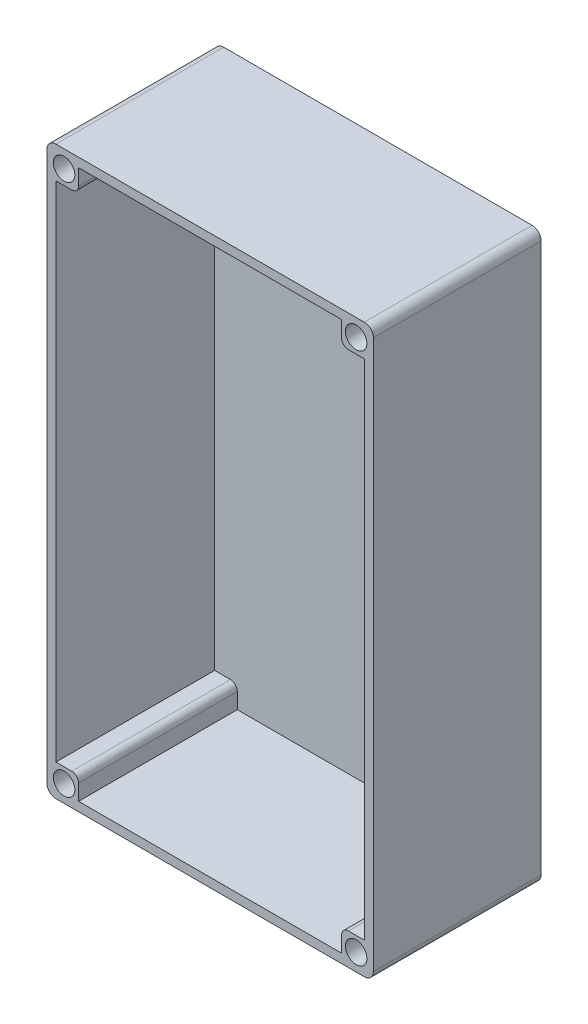
ISO-10303-21;
HEADER;
FILE_DESCRIPTION(('STEP AP214'),'2;1');
FILE_NAME('part.step','',(''),(''),'','','');
FILE_SCHEMA(('AUTOMOTIVE_DESIGN { 1 0 10303 214 1 1 1 1 }'));
ENDSEC;
DATA;
#1=APPLICATION_CONTEXT('core data for automotive mechanical design processes');
#2=APPLICATION_PROTOCOL_DEFINITION('international standard','automotive_design',2000,#1);
#3=PRODUCT_CONTEXT('',#1,'mechanical');
#4=PRODUCT('Part','Part','',(#3));
#5=PRODUCT_RELATED_PRODUCT_CATEGORY('part','',(#4));
#6=PRODUCT_DEFINITION_FORMATION('','',#4);
#7=PRODUCT_DEFINITION_CONTEXT('part definition',#1,'design');
#8=PRODUCT_DEFINITION('design','',#6,#7);
#9=PRODUCT_DEFINITION_SHAPE('','',#8);
#10=(LENGTH_UNIT() NAMED_UNIT(*) SI_UNIT(.MILLI.,.METRE.));
#11=(NAMED_UNIT(*) PLANE_ANGLE_UNIT() SI_UNIT($,.RADIAN.));
#12=(NAMED_UNIT(*) SI_UNIT($,.STERADIAN.) SOLID_ANGLE_UNIT());
#13=UNCERTAINTY_MEASURE_WITH_UNIT(LENGTH_MEASURE(1.E-05),#10,'distance_accuracy_value','');
#14=(GEOMETRIC_REPRESENTATION_CONTEXT(3) GLOBAL_UNCERTAINTY_ASSIGNED_CONTEXT((#13)) GLOBAL_UNIT_ASSIGNED_CONTEXT((#10,
#11,#12)) REPRESENTATION_CONTEXT('',''));
#15=CARTESIAN_POINT('',(0.,0.,0.));
#16=DIRECTION('',(0.,0.,1.));
#17=DIRECTION('',(1.,0.,0.));
#18=AXIS2_PLACEMENT_3D('',#15,#16,#17);
#19=CARTESIAN_POINT('',(0.,0.,2.));
#20=DIRECTION('',(0.,0.,1.));
#21=DIRECTION('',(1.,0.,0.));
#22=AXIS2_PLACEMENT_3D('',#19,#20,#21);
#23=PLANE('',#22);
#24=DIRECTION('',(0.,-1.,0.));
#25=VECTOR('',#24,1.);
#26=CARTESIAN_POINT('',(29.,-73.,2.));
#27=LINE('',#26,#25);
#28=CARTESIAN_POINT('',(29.,-69.5,2.));
#29=VERTEX_POINT('',#28);
#30=CARTESIAN_POINT('',(29.,-73.,2.));
#31=VERTEX_POINT('',#30);
#32=EDGE_CURVE('E211',#29,#31,#27,.T.);
#33=ORIENTED_EDGE('',*,*,#32,.F.);
#34=CARTESIAN_POINT('',(30.5,-69.5,2.));
#35=DIRECTION('',(0.,0.,1.));
#36=DIRECTION('',(1.,0.,0.));
#37=AXIS2_PLACEMENT_3D('',#34,#35,#36);
#38=CIRCLE('',#37,1.5);
#39=CARTESIAN_POINT('',(30.5,-68.,2.));
#40=VERTEX_POINT('',#39);
#41=EDGE_CURVE('E11',#29,#40,#38,.F.);
#42=ORIENTED_EDGE('',*,*,#41,.T.);
#43=DIRECTION('',(-1.,0.,0.));
#44=VECTOR('',#43,1.);
#45=CARTESIAN_POINT('',(34.,-68.,2.));
#46=LINE('',#45,#44);
#47=CARTESIAN_POINT('',(34.,-68.,2.));
#48=VERTEX_POINT('',#47);
#49=EDGE_CURVE('E212',#48,#40,#46,.T.);
#50=ORIENTED_EDGE('',*,*,#49,.F.);
#51=DIRECTION('',(0.,1.,0.));
#52=VECTOR('',#51,1.);
#53=CARTESIAN_POINT('',(34.,-75.,2.));
#54=LINE('',#53,#52);
#55=CARTESIAN_POINT('',(34.,43.,2.));
#56=VERTEX_POINT('',#55);
#57=EDGE_CURVE('E288',#48,#56,#54,.T.);
#58=ORIENTED_EDGE('',*,*,#57,.T.);
#59=DIRECTION('',(-1.,0.,0.));
#60=VECTOR('',#59,1.);
#61=CARTESIAN_POINT('',(29.,43.,2.));
#62=LINE('',#61,#60);
#63=CARTESIAN_POINT('',(30.5,43.,2.));
#64=VERTEX_POINT('',#63);
#65=EDGE_CURVE('E257',#56,#64,#62,.T.);
#66=ORIENTED_EDGE('',*,*,#65,.T.);
#67=CARTESIAN_POINT('',(30.5,44.5,2.));
#68=DIRECTION('',(0.,0.,1.));
#69=DIRECTION('',(1.,0.,0.));
#70=AXIS2_PLACEMENT_3D('',#67,#68,#69);
#71=CIRCLE('',#70,1.5);
#72=CARTESIAN_POINT('',(29.,44.5,2.));
#73=VERTEX_POINT('',#72);
#74=EDGE_CURVE('E349',#64,#73,#71,.F.);
#75=ORIENTED_EDGE('',*,*,#74,.T.);
#76=DIRECTION('',(0.,1.,0.));
#77=VECTOR('',#76,1.);
#78=CARTESIAN_POINT('',(29.,43.,2.));
#79=LINE('',#78,#77);
#80=CARTESIAN_POINT('',(29.,48.,2.));
#81=VERTEX_POINT('',#80);
#82=EDGE_CURVE('E254',#73,#81,#79,.T.);
#83=ORIENTED_EDGE('',*,*,#82,.T.);
#84=DIRECTION('',(1.,0.,0.));
#85=VECTOR('',#84,1.);
#86=CARTESIAN_POINT('',(-36.,48.,2.));
#87=LINE('',#86,#85);
#88=CARTESIAN_POINT('',(-29.,48.,2.));
#89=VERTEX_POINT('',#88);
#90=EDGE_CURVE('E306',#89,#81,#87,.T.);
#91=ORIENTED_EDGE('',*,*,#90,.F.);
#92=DIRECTION('',(0.,1.,0.));
#93=VECTOR('',#92,1.);
#94=CARTESIAN_POINT('',(-29.,43.,2.));
#95=LINE('',#94,#93);
#96=CARTESIAN_POINT('',(-29.,44.5,2.));
#97=VERTEX_POINT('',#96);
#98=EDGE_CURVE('E276',#97,#89,#95,.T.);
#99=ORIENTED_EDGE('',*,*,#98,.F.);
#100=CARTESIAN_POINT('',(-30.5,44.5,2.));
#101=DIRECTION('',(0.,0.,1.));
#102=DIRECTION('',(1.,0.,0.));
#103=AXIS2_PLACEMENT_3D('',#100,#101,#102);
#104=CIRCLE('',#103,1.5);
#105=CARTESIAN_POINT('',(-30.5,43.,2.));
#106=VERTEX_POINT('',#105);
#107=EDGE_CURVE('E340',#97,#106,#104,.F.);
#108=ORIENTED_EDGE('',*,*,#107,.T.);
#109=DIRECTION('',(1.,0.,0.));
#110=VECTOR('',#109,1.);
#111=CARTESIAN_POINT('',(-29.,43.,2.));
#112=LINE('',#111,#110);
#113=CARTESIAN_POINT('',(-34.,43.,2.));
#114=VERTEX_POINT('',#113);
#115=EDGE_CURVE('E279',#114,#106,#112,.T.);
#116=ORIENTED_EDGE('',*,*,#115,.F.);
#117=DIRECTION('',(0.,1.,0.));
#118=VECTOR('',#117,1.);
#119=CARTESIAN_POINT('',(-34.,-75.,2.));
#120=LINE('',#119,#118);
#121=CARTESIAN_POINT('',(-34.,-68.,2.));
#122=VERTEX_POINT('',#121);
#123=EDGE_CURVE('E300',#122,#114,#120,.T.);
#124=ORIENTED_EDGE('',*,*,#123,.F.);
#125=DIRECTION('',(1.,0.,0.));
#126=VECTOR('',#125,1.);
#127=CARTESIAN_POINT('',(-34.,-68.,2.));
#128=LINE('',#127,#126);
#129=CARTESIAN_POINT('',(-30.5,-68.,2.));
#130=VERTEX_POINT('',#129);
#131=EDGE_CURVE('E237',#122,#130,#128,.T.);
#132=ORIENTED_EDGE('',*,*,#131,.T.);
#133=CARTESIAN_POINT('',(-30.5,-69.5,2.));
#134=DIRECTION('',(0.,0.,1.));
#135=DIRECTION('',(1.,0.,0.));
#136=AXIS2_PLACEMENT_3D('',#133,#134,#135);
#137=CIRCLE('',#136,1.5);
#138=CARTESIAN_POINT('',(-29.,-69.5,2.));
#139=VERTEX_POINT('',#138);
#140=EDGE_CURVE('E391',#130,#139,#137,.F.);
#141=ORIENTED_EDGE('',*,*,#140,.T.);
#142=DIRECTION('',(0.,-1.,0.));
#143=VECTOR('',#142,1.);
#144=CARTESIAN_POINT('',(-29.,-73.,2.));
#145=LINE('',#144,#143);
#146=CARTESIAN_POINT('',(-29.,-73.,2.));
#147=VERTEX_POINT('',#146);
#148=EDGE_CURVE('E234',#139,#147,#145,.T.);
#149=ORIENTED_EDGE('',*,*,#148,.T.);
#150=DIRECTION('',(-1.,0.,0.));
#151=VECTOR('',#150,1.);
#152=CARTESIAN_POINT('',(-34.,-73.,2.));
#153=LINE('',#152,#151);
#154=EDGE_CURVE('E207',#31,#147,#153,.T.);
#155=ORIENTED_EDGE('',*,*,#154,.F.);
#156=EDGE_LOOP('',(#33,#42,#50,#58,#66,#75,#83,#91,#99,#108,#116,#124,#132,#141,#149,#155));
#157=FACE_BOUND('',#156,.T.);
#158=ADVANCED_FACE('F37',(#157),#23,.T.);
#159=CARTESIAN_POINT('',(34.,-75.,37.));
#160=DIRECTION('',(-1.,0.,0.));
#161=DIRECTION('',(0.,0.,1.));
#162=AXIS2_PLACEMENT_3D('',#159,#160,#161);
#163=PLANE('',#162);
#164=ORIENTED_EDGE('',*,*,#57,.F.);
#165=DIRECTION('',(0.,0.,1.));
#166=VECTOR('',#165,1.);
#167=CARTESIAN_POINT('',(34.,-68.,-5.07106781186548));
#168=LINE('',#167,#166);
#169=CARTESIAN_POINT('',(34.,-68.,37.));
#170=VERTEX_POINT('',#169);
#171=EDGE_CURVE('E213',#48,#170,#168,.T.);
#172=ORIENTED_EDGE('',*,*,#171,.T.);
#173=DIRECTION('',(0.,1.,0.));
#174=VECTOR('',#173,1.);
#175=CARTESIAN_POINT('',(34.,-75.,37.));
#176=LINE('',#175,#174);
#177=CARTESIAN_POINT('',(34.,43.,37.));
#178=VERTEX_POINT('',#177);
#179=EDGE_CURVE('E295',#170,#178,#176,.T.);
#180=ORIENTED_EDGE('',*,*,#179,.T.);
#181=DIRECTION('',(0.,0.,-1.));
#182=VECTOR('',#181,1.);
#183=CARTESIAN_POINT('',(34.,43.,44.0710678118655));
#184=LINE('',#183,#182);
#185=EDGE_CURVE('E260',#178,#56,#184,.T.);
#186=ORIENTED_EDGE('',*,*,#185,.T.);
#187=EDGE_LOOP('',(#164,#172,#180,#186));
#188=FACE_BOUND('',#187,.T.);
#189=ADVANCED_FACE('F407',(#188),#163,.T.);
#190=CARTESIAN_POINT('',(-34.,-73.,105.02940540678));
#191=DIRECTION('',(0.,-1.,0.));
#192=DIRECTION('',(0.,0.,-1.));
#193=AXIS2_PLACEMENT_3D('',#190,#191,#192);
#194=PLANE('',#193);
#195=DIRECTION('',(0.,0.,1.));
#196=VECTOR('',#195,1.);
#197=CARTESIAN_POINT('',(29.,-73.,-5.07106781186548));
#198=LINE('',#197,#196);
#199=CARTESIAN_POINT('',(29.,-73.,37.));
#200=VERTEX_POINT('',#199);
#201=EDGE_CURVE('E200',#31,#200,#198,.T.);
#202=ORIENTED_EDGE('',*,*,#201,.F.);
#203=ORIENTED_EDGE('',*,*,#154,.T.);
#204=DIRECTION('',(0.,0.,1.));
#205=VECTOR('',#204,1.);
#206=CARTESIAN_POINT('',(-29.,-73.,-5.07106781186548));
#207=LINE('',#206,#205);
#208=CARTESIAN_POINT('',(-29.,-73.,37.));
#209=VERTEX_POINT('',#208);
#210=EDGE_CURVE('E203',#147,#209,#207,.T.);
#211=ORIENTED_EDGE('',*,*,#210,.T.);
#212=DIRECTION('',(-1.,0.,0.));
#213=VECTOR('',#212,1.);
#214=CARTESIAN_POINT('',(-34.,-73.,37.));
#215=LINE('',#214,#213);
#216=EDGE_CURVE('E197',#200,#209,#215,.T.);
#217=ORIENTED_EDGE('',*,*,#216,.F.);
#218=EDGE_LOOP('',(#202,#203,#211,#217));
#219=FACE_BOUND('',#218,.T.);
#220=ADVANCED_FACE('F199',(#219),#194,.F.);
#221=CARTESIAN_POINT('',(-34.,-75.,37.));
#222=DIRECTION('',(-1.,0.,0.));
#223=DIRECTION('',(0.,0.,1.));
#224=AXIS2_PLACEMENT_3D('',#221,#222,#223);
#225=PLANE('',#224);
#226=DIRECTION('',(0.,1.,0.));
#227=VECTOR('',#226,1.);
#228=CARTESIAN_POINT('',(-34.,-75.,37.));
#229=LINE('',#228,#227);
#230=CARTESIAN_POINT('',(-34.,-68.,37.));
#231=VERTEX_POINT('',#230);
#232=CARTESIAN_POINT('',(-34.,43.,37.));
#233=VERTEX_POINT('',#232);
#234=EDGE_CURVE('E301',#231,#233,#229,.T.);
#235=ORIENTED_EDGE('',*,*,#234,.F.);
#236=DIRECTION('',(0.,0.,1.));
#237=VECTOR('',#236,1.);
#238=CARTESIAN_POINT('',(-34.,-68.,-5.07106781186548));
#239=LINE('',#238,#237);
#240=EDGE_CURVE('E238',#122,#231,#239,.T.);
#241=ORIENTED_EDGE('',*,*,#240,.F.);
#242=ORIENTED_EDGE('',*,*,#123,.T.);
#243=DIRECTION('',(0.,0.,-1.));
#244=VECTOR('',#243,1.);
#245=CARTESIAN_POINT('',(-34.,43.,44.0710678118655));
#246=LINE('',#245,#244);
#247=EDGE_CURVE('E283',#233,#114,#246,.T.);
#248=ORIENTED_EDGE('',*,*,#247,.F.);
#249=EDGE_LOOP('',(#235,#241,#242,#248));
#250=FACE_BOUND('',#249,.T.);
#251=ADVANCED_FACE('F499',(#250),#225,.F.);
#252=CARTESIAN_POINT('',(-36.,48.,37.));
#253=DIRECTION('',(0.,1.,0.));
#254=DIRECTION('',(-1.,0.,0.));
#255=AXIS2_PLACEMENT_3D('',#252,#253,#254);
#256=PLANE('',#255);
#257=ORIENTED_EDGE('',*,*,#90,.T.);
#258=DIRECTION('',(0.,0.,-1.));
#259=VECTOR('',#258,1.);
#260=CARTESIAN_POINT('',(29.,48.,44.0710678118655));
#261=LINE('',#260,#259);
#262=CARTESIAN_POINT('',(29.,48.,37.));
#263=VERTEX_POINT('',#262);
#264=EDGE_CURVE('E264',#263,#81,#261,.T.);
#265=ORIENTED_EDGE('',*,*,#264,.F.);
#266=DIRECTION('',(1.,0.,0.));
#267=VECTOR('',#266,1.);
#268=CARTESIAN_POINT('',(-36.,48.,37.));
#269=LINE('',#268,#267);
#270=CARTESIAN_POINT('',(-29.,48.,37.));
#271=VERTEX_POINT('',#270);
#272=EDGE_CURVE('E310',#271,#263,#269,.T.);
#273=ORIENTED_EDGE('',*,*,#272,.F.);
#274=DIRECTION('',(0.,0.,-1.));
#275=VECTOR('',#274,1.);
#276=CARTESIAN_POINT('',(-29.,48.,44.0710678118655));
#277=LINE('',#276,#275);
#278=EDGE_CURVE('E285',#271,#89,#277,.T.);
#279=ORIENTED_EDGE('',*,*,#278,.T.);
#280=EDGE_LOOP('',(#257,#265,#273,#279));
#281=FACE_BOUND('',#280,.T.);
#282=ADVANCED_FACE('F425',(#281),#256,.F.);
#283=CARTESIAN_POINT('',(-36.,50.,2.));
#284=DIRECTION('',(1.,0.,0.));
#285=DIRECTION('',(0.,1.,0.));
#286=AXIS2_PLACEMENT_3D('',#283,#284,#285);
#287=PLANE('',#286);
#288=DIRECTION('',(0.,-1.,0.));
#289=VECTOR('',#288,1.);
#290=CARTESIAN_POINT('',(-36.,50.,37.));
#291=LINE('',#290,#289);
#292=CARTESIAN_POINT('',(-36.,48.,37.));
#293=VERTEX_POINT('',#292);
#294=CARTESIAN_POINT('',(-36.,-73.,37.));
#295=VERTEX_POINT('',#294);
#296=EDGE_CURVE('E307',#293,#295,#291,.T.);
#297=ORIENTED_EDGE('',*,*,#296,.F.);
#298=DIRECTION('',(0.,0.,-1.));
#299=VECTOR('',#298,1.);
#300=CARTESIAN_POINT('',(-36.,48.,2.));
#301=LINE('',#300,#299);
#302=CARTESIAN_POINT('',(-36.,48.,0.));
#303=VERTEX_POINT('',#302);
#304=EDGE_CURVE('E353',#293,#303,#301,.T.);
#305=ORIENTED_EDGE('',*,*,#304,.T.);
#306=DIRECTION('',(0.,-1.,0.));
#307=VECTOR('',#306,1.);
#308=CARTESIAN_POINT('',(-36.,50.,0.));
#309=LINE('',#308,#307);
#310=CARTESIAN_POINT('',(-36.,-73.,0.));
#311=VERTEX_POINT('',#310);
#312=EDGE_CURVE('E319',#303,#311,#309,.T.);
#313=ORIENTED_EDGE('',*,*,#312,.T.);
#314=DIRECTION('',(0.,0.,-1.));
#315=VECTOR('',#314,1.);
#316=CARTESIAN_POINT('',(-36.,-73.,2.));
#317=LINE('',#316,#315);
#318=EDGE_CURVE('E351',#311,#295,#317,.F.);
#319=ORIENTED_EDGE('',*,*,#318,.T.);
#320=EDGE_LOOP('',(#297,#305,#313,#319));
#321=FACE_BOUND('',#320,.T.);
#322=ADVANCED_FACE('F442',(#321),#287,.F.);
#323=CARTESIAN_POINT('',(-36.,-75.,2.));
#324=DIRECTION('',(0.,1.,0.));
#325=DIRECTION('',(-1.,0.,0.));
#326=AXIS2_PLACEMENT_3D('',#323,#324,#325);
#327=PLANE('',#326);
#328=DIRECTION('',(1.,0.,0.));
#329=VECTOR('',#328,1.);
#330=CARTESIAN_POINT('',(-36.,-75.,0.));
#331=LINE('',#330,#329);
#332=CARTESIAN_POINT('',(-34.,-75.,0.));
#333=VERTEX_POINT('',#332);
#334=CARTESIAN_POINT('',(34.,-75.,0.));
#335=VERTEX_POINT('',#334);
#336=EDGE_CURVE('E324',#333,#335,#331,.T.);
#337=ORIENTED_EDGE('',*,*,#336,.T.);
#338=DIRECTION('',(0.,0.,-1.));
#339=VECTOR('',#338,1.);
#340=CARTESIAN_POINT('',(34.,-75.,37.));
#341=LINE('',#340,#339);
#342=CARTESIAN_POINT('',(34.,-75.,37.));
#343=VERTEX_POINT('',#342);
#344=EDGE_CURVE('E297',#343,#335,#341,.T.);
#345=ORIENTED_EDGE('',*,*,#344,.F.);
#346=DIRECTION('',(1.,0.,0.));
#347=VECTOR('',#346,1.);
#348=CARTESIAN_POINT('',(-34.,-75.,37.));
#349=LINE('',#348,#347);
#350=CARTESIAN_POINT('',(-34.,-75.,37.));
#351=VERTEX_POINT('',#350);
#352=EDGE_CURVE('E206',#351,#343,#349,.T.);
#353=ORIENTED_EDGE('',*,*,#352,.F.);
#354=DIRECTION('',(0.,0.,-1.));
#355=VECTOR('',#354,1.);
#356=CARTESIAN_POINT('',(-34.,-75.,37.));
#357=LINE('',#356,#355);
#358=EDGE_CURVE('E303',#351,#333,#357,.T.);
#359=ORIENTED_EDGE('',*,*,#358,.T.);
#360=EDGE_LOOP('',(#337,#345,#353,#359));
#361=FACE_BOUND('',#360,.T.);
#362=ADVANCED_FACE('F438',(#361),#327,.F.);
#363=CARTESIAN_POINT('',(36.,50.,2.));
#364=DIRECTION('',(-1.,0.,0.));
#365=DIRECTION('',(0.,-1.,0.));
#366=AXIS2_PLACEMENT_3D('',#363,#364,#365);
#367=PLANE('',#366);
#368=DIRECTION('',(0.,1.,0.));
#369=VECTOR('',#368,1.);
#370=CARTESIAN_POINT('',(36.,50.,0.));
#371=LINE('',#370,#369);
#372=CARTESIAN_POINT('',(36.,-73.,0.));
#373=VERTEX_POINT('',#372);
#374=CARTESIAN_POINT('',(36.,48.,0.));
#375=VERTEX_POINT('',#374);
#376=EDGE_CURVE('E327',#373,#375,#371,.T.);
#377=ORIENTED_EDGE('',*,*,#376,.T.);
#378=DIRECTION('',(0.,0.,-1.));
#379=VECTOR('',#378,1.);
#380=CARTESIAN_POINT('',(36.,48.,2.));
#381=LINE('',#380,#379);
#382=CARTESIAN_POINT('',(36.,48.,37.));
#383=VERTEX_POINT('',#382);
#384=EDGE_CURVE('E382',#375,#383,#381,.F.);
#385=ORIENTED_EDGE('',*,*,#384,.T.);
#386=DIRECTION('',(0.,1.,0.));
#387=VECTOR('',#386,1.);
#388=CARTESIAN_POINT('',(36.,50.,37.));
#389=LINE('',#388,#387);
#390=CARTESIAN_POINT('',(36.0000000000004,-73.,37.));
#391=VERTEX_POINT('',#390);
#392=EDGE_CURVE('E313',#391,#383,#389,.T.);
#393=ORIENTED_EDGE('',*,*,#392,.F.);
#394=DIRECTION('',(0.,0.,-1.));
#395=VECTOR('',#394,1.);
#396=CARTESIAN_POINT('',(36.,-73.,2.));
#397=LINE('',#396,#395);
#398=EDGE_CURVE('E379',#391,#373,#397,.T.);
#399=ORIENTED_EDGE('',*,*,#398,.T.);
#400=EDGE_LOOP('',(#377,#385,#393,#399));
#401=FACE_BOUND('',#400,.T.);
#402=ADVANCED_FACE('F434',(#401),#367,.F.);
#403=CARTESIAN_POINT('',(-36.,50.,2.));
#404=DIRECTION('',(0.,-1.,0.));
#405=DIRECTION('',(0.,0.,-1.));
#406=AXIS2_PLACEMENT_3D('',#403,#404,#405);
#407=PLANE('',#406);
#408=DIRECTION('',(-1.,0.,0.));
#409=VECTOR('',#408,1.);
#410=CARTESIAN_POINT('',(-36.,50.,0.));
#411=LINE('',#410,#409);
#412=CARTESIAN_POINT('',(34.,50.,0.));
#413=VERTEX_POINT('',#412);
#414=CARTESIAN_POINT('',(-34.,50.,0.));
#415=VERTEX_POINT('',#414);
#416=EDGE_CURVE('E330',#413,#415,#411,.T.);
#417=ORIENTED_EDGE('',*,*,#416,.T.);
#418=DIRECTION('',(0.,0.,-1.));
#419=VECTOR('',#418,1.);
#420=CARTESIAN_POINT('',(-34.,50.,2.));
#421=LINE('',#420,#419);
#422=CARTESIAN_POINT('',(-34.,50.,37.));
#423=VERTEX_POINT('',#422);
#424=EDGE_CURVE('E368',#415,#423,#421,.F.);
#425=ORIENTED_EDGE('',*,*,#424,.T.);
#426=DIRECTION('',(-1.,0.,0.));
#427=VECTOR('',#426,1.);
#428=CARTESIAN_POINT('',(-36.,50.,37.));
#429=LINE('',#428,#427);
#430=CARTESIAN_POINT('',(34.,50.,37.));
#431=VERTEX_POINT('',#430);
#432=EDGE_CURVE('E316',#431,#423,#429,.T.);
#433=ORIENTED_EDGE('',*,*,#432,.F.);
#434=DIRECTION('',(0.,0.,-1.));
#435=VECTOR('',#434,1.);
#436=CARTESIAN_POINT('',(34.,50.,2.));
#437=LINE('',#436,#435);
#438=EDGE_CURVE('E365',#431,#413,#437,.T.);
#439=ORIENTED_EDGE('',*,*,#438,.T.);
#440=EDGE_LOOP('',(#417,#425,#433,#439));
#441=FACE_BOUND('',#440,.T.);
#442=ADVANCED_FACE('F430',(#441),#407,.F.);
#443=CARTESIAN_POINT('',(0.,0.,0.));
#444=DIRECTION('',(0.,0.,1.));
#445=DIRECTION('',(1.,0.,0.));
#446=AXIS2_PLACEMENT_3D('',#443,#444,#445);
#447=PLANE('',#446);
#448=CARTESIAN_POINT('',(32.2,-71.2,0.));
#449=DIRECTION('',(0.,0.,-1.));
#450=DIRECTION('',(-1.,0.,0.));
#451=AXIS2_PLACEMENT_3D('',#448,#449,#450);
#452=CIRCLE('',#451,2.375);
#453=CARTESIAN_POINT('',(29.825,-71.2,0.));
#454=VERTEX_POINT('',#453);
#455=EDGE_CURVE('E221',#454,#454,#452,.T.);
#456=ORIENTED_EDGE('',*,*,#455,.F.);
#457=EDGE_LOOP('',(#456));
#458=FACE_BOUND('',#457,.T.);
#459=CARTESIAN_POINT('',(-32.2,-71.2,0.));
#460=DIRECTION('',(0.,0.,1.));
#461=DIRECTION('',(1.,0.,0.));
#462=AXIS2_PLACEMENT_3D('',#459,#460,#461);
#463=CIRCLE('',#462,2.375);
#464=CARTESIAN_POINT('',(-29.825,-71.2,0.));
#465=VERTEX_POINT('',#464);
#466=EDGE_CURVE('E227',#465,#465,#463,.T.);
#467=ORIENTED_EDGE('',*,*,#466,.T.);
#468=EDGE_LOOP('',(#467));
#469=FACE_BOUND('',#468,.T.);
#470=CARTESIAN_POINT('',(32.2,46.2,0.));
#471=DIRECTION('',(0.,0.,-1.));
#472=DIRECTION('',(-1.,0.,0.));
#473=AXIS2_PLACEMENT_3D('',#470,#471,#472);
#474=CIRCLE('',#473,2.375);
#475=CARTESIAN_POINT('',(29.825,46.2,0.));
#476=VERTEX_POINT('',#475);
#477=EDGE_CURVE('E251',#476,#476,#474,.T.);
#478=ORIENTED_EDGE('',*,*,#477,.F.);
#479=EDGE_LOOP('',(#478));
#480=FACE_BOUND('',#479,.T.);
#481=CARTESIAN_POINT('',(-32.2,46.2,0.));
#482=DIRECTION('',(0.,0.,1.));
#483=DIRECTION('',(1.,0.,0.));
#484=AXIS2_PLACEMENT_3D('',#481,#482,#483);
#485=CIRCLE('',#484,2.375);
#486=CARTESIAN_POINT('',(-29.825,46.2,0.));
#487=VERTEX_POINT('',#486);
#488=EDGE_CURVE('E273',#487,#487,#485,.T.);
#489=ORIENTED_EDGE('',*,*,#488,.T.);
#490=EDGE_LOOP('',(#489));
#491=FACE_BOUND('',#490,.T.);
#492=ORIENTED_EDGE('',*,*,#312,.F.);
#493=CARTESIAN_POINT('',(-34.,48.,0.));
#494=DIRECTION('',(0.,0.,1.));
#495=DIRECTION('',(1.,0.,0.));
#496=AXIS2_PLACEMENT_3D('',#493,#494,#495);
#497=CIRCLE('',#496,2.);
#498=EDGE_CURVE('E363',#303,#415,#497,.F.);
#499=ORIENTED_EDGE('',*,*,#498,.T.);
#500=ORIENTED_EDGE('',*,*,#416,.F.);
#501=CARTESIAN_POINT('',(34.,48.,0.));
#502=DIRECTION('',(0.,0.,1.));
#503=DIRECTION('',(1.,0.,0.));
#504=AXIS2_PLACEMENT_3D('',#501,#502,#503);
#505=CIRCLE('',#504,2.);
#506=EDGE_CURVE('E361',#413,#375,#505,.F.);
#507=ORIENTED_EDGE('',*,*,#506,.T.);
#508=ORIENTED_EDGE('',*,*,#376,.F.);
#509=CARTESIAN_POINT('',(34.,-73.,0.));
#510=DIRECTION('',(0.,0.,1.));
#511=DIRECTION('',(1.,0.,0.));
#512=AXIS2_PLACEMENT_3D('',#509,#510,#511);
#513=CIRCLE('',#512,2.);
#514=EDGE_CURVE('E356',#373,#335,#513,.F.);
#515=ORIENTED_EDGE('',*,*,#514,.T.);
#516=ORIENTED_EDGE('',*,*,#336,.F.);
#517=CARTESIAN_POINT('',(-34.,-73.,0.));
#518=DIRECTION('',(0.,0.,1.));
#519=DIRECTION('',(1.,0.,0.));
#520=AXIS2_PLACEMENT_3D('',#517,#518,#519);
#521=CIRCLE('',#520,2.);
#522=EDGE_CURVE('E359',#333,#311,#521,.F.);
#523=ORIENTED_EDGE('',*,*,#522,.T.);
#524=EDGE_LOOP('',(#492,#499,#500,#507,#508,#515,#516,#523));
#525=FACE_BOUND('',#524,.T.);
#526=ADVANCED_FACE('F427',(#458,#469,#480,#491,#525),#447,.F.);
#527=CARTESIAN_POINT('',(0.,0.,37.));
#528=DIRECTION('',(0.,0.,1.));
#529=DIRECTION('',(1.,0.,0.));
#530=AXIS2_PLACEMENT_3D('',#527,#528,#529);
#531=PLANE('',#530);
#532=CARTESIAN_POINT('',(32.2,-71.2,37.));
#533=DIRECTION('',(0.,0.,-1.));
#534=DIRECTION('',(-1.,0.,0.));
#535=AXIS2_PLACEMENT_3D('',#532,#533,#534);
#536=CIRCLE('',#535,2.375);
#537=CARTESIAN_POINT('',(29.825,-71.2,37.));
#538=VERTEX_POINT('',#537);
#539=EDGE_CURVE('E544',#538,#538,#536,.T.);
#540=ORIENTED_EDGE('',*,*,#539,.T.);
#541=EDGE_LOOP('',(#540));
#542=FACE_BOUND('',#541,.T.);
#543=DIRECTION('',(1.,0.,0.));
#544=VECTOR('',#543,1.);
#545=CARTESIAN_POINT('',(34.,-68.,37.));
#546=LINE('',#545,#544);
#547=CARTESIAN_POINT('',(30.5,-68.,37.));
#548=VERTEX_POINT('',#547);
#549=EDGE_CURVE('E217',#548,#170,#546,.T.);
#550=ORIENTED_EDGE('',*,*,#549,.F.);
#551=CARTESIAN_POINT('',(30.5,-69.5,37.));
#552=DIRECTION('',(0.,0.,1.));
#553=DIRECTION('',(1.,0.,0.));
#554=AXIS2_PLACEMENT_3D('',#551,#552,#553);
#555=CIRCLE('',#554,1.5);
#556=CARTESIAN_POINT('',(29.,-69.5,37.));
#557=VERTEX_POINT('',#556);
#558=EDGE_CURVE('E59',#548,#557,#555,.T.);
#559=ORIENTED_EDGE('',*,*,#558,.T.);
#560=DIRECTION('',(0.,1.,0.));
#561=VECTOR('',#560,1.);
#562=CARTESIAN_POINT('',(29.,-73.,37.));
#563=LINE('',#562,#561);
#564=EDGE_CURVE('E210',#200,#557,#563,.T.);
#565=ORIENTED_EDGE('',*,*,#564,.F.);
#566=ORIENTED_EDGE('',*,*,#216,.T.);
#567=DIRECTION('',(0.,1.,0.));
#568=VECTOR('',#567,1.);
#569=CARTESIAN_POINT('',(-29.,-73.,37.));
#570=LINE('',#569,#568);
#571=CARTESIAN_POINT('',(-29.,-69.5,37.));
#572=VERTEX_POINT('',#571);
#573=EDGE_CURVE('E230',#209,#572,#570,.T.);
#574=ORIENTED_EDGE('',*,*,#573,.T.);
#575=CARTESIAN_POINT('',(-30.5,-69.5,37.));
#576=DIRECTION('',(0.,0.,1.));
#577=DIRECTION('',(1.,0.,0.));
#578=AXIS2_PLACEMENT_3D('',#575,#576,#577);
#579=CIRCLE('',#578,1.5);
#580=CARTESIAN_POINT('',(-30.5,-68.,37.));
#581=VERTEX_POINT('',#580);
#582=EDGE_CURVE('E387',#572,#581,#579,.T.);
#583=ORIENTED_EDGE('',*,*,#582,.T.);
#584=DIRECTION('',(-1.,0.,0.));
#585=VECTOR('',#584,1.);
#586=CARTESIAN_POINT('',(-34.,-68.,37.));
#587=LINE('',#586,#585);
#588=EDGE_CURVE('E242',#581,#231,#587,.T.);
#589=ORIENTED_EDGE('',*,*,#588,.T.);
#590=ORIENTED_EDGE('',*,*,#234,.T.);
#591=DIRECTION('',(1.,0.,0.));
#592=VECTOR('',#591,1.);
#593=CARTESIAN_POINT('',(-29.,43.,37.));
#594=LINE('',#593,#592);
#595=CARTESIAN_POINT('',(-30.5,43.,37.));
#596=VERTEX_POINT('',#595);
#597=EDGE_CURVE('E282',#233,#596,#594,.T.);
#598=ORIENTED_EDGE('',*,*,#597,.T.);
#599=CARTESIAN_POINT('',(-30.5,44.5,37.));
#600=DIRECTION('',(0.,0.,1.));
#601=DIRECTION('',(1.,0.,0.));
#602=AXIS2_PLACEMENT_3D('',#599,#600,#601);
#603=CIRCLE('',#602,1.5);
#604=CARTESIAN_POINT('',(-29.,44.5,37.));
#605=VERTEX_POINT('',#604);
#606=EDGE_CURVE('E338',#596,#605,#603,.T.);
#607=ORIENTED_EDGE('',*,*,#606,.T.);
#608=DIRECTION('',(0.,1.,0.));
#609=VECTOR('',#608,1.);
#610=CARTESIAN_POINT('',(-29.,43.,37.));
#611=LINE('',#610,#609);
#612=EDGE_CURVE('E286',#605,#271,#611,.T.);
#613=ORIENTED_EDGE('',*,*,#612,.T.);
#614=ORIENTED_EDGE('',*,*,#272,.T.);
#615=DIRECTION('',(0.,1.,0.));
#616=VECTOR('',#615,1.);
#617=CARTESIAN_POINT('',(29.,43.,37.));
#618=LINE('',#617,#616);
#619=CARTESIAN_POINT('',(29.,44.5,37.));
#620=VERTEX_POINT('',#619);
#621=EDGE_CURVE('E262',#620,#263,#618,.T.);
#622=ORIENTED_EDGE('',*,*,#621,.F.);
#623=CARTESIAN_POINT('',(30.5,44.5,37.));
#624=DIRECTION('',(0.,0.,1.));
#625=DIRECTION('',(1.,0.,0.));
#626=AXIS2_PLACEMENT_3D('',#623,#624,#625);
#627=CIRCLE('',#626,1.5);
#628=CARTESIAN_POINT('',(30.5,43.,37.));
#629=VERTEX_POINT('',#628);
#630=EDGE_CURVE('E347',#620,#629,#627,.T.);
#631=ORIENTED_EDGE('',*,*,#630,.T.);
#632=DIRECTION('',(-1.,0.,0.));
#633=VECTOR('',#632,1.);
#634=CARTESIAN_POINT('',(29.,43.,37.));
#635=LINE('',#634,#633);
#636=EDGE_CURVE('E265',#178,#629,#635,.T.);
#637=ORIENTED_EDGE('',*,*,#636,.F.);
#638=ORIENTED_EDGE('',*,*,#179,.F.);
#639=EDGE_LOOP('',(#550,#559,#565,#566,#574,#583,#589,#590,#598,#607,#613,#614,#622,#631,#637,#638));
#640=FACE_BOUND('',#639,.T.);
#641=CARTESIAN_POINT('',(-32.2,-71.2,37.));
#642=DIRECTION('',(0.,0.,1.));
#643=DIRECTION('',(1.,0.,0.));
#644=AXIS2_PLACEMENT_3D('',#641,#642,#643);
#645=CIRCLE('',#644,2.375);
#646=CARTESIAN_POINT('',(-29.825,-71.2,37.));
#647=VERTEX_POINT('',#646);
#648=EDGE_CURVE('E231',#647,#647,#645,.T.);
#649=ORIENTED_EDGE('',*,*,#648,.F.);
#650=EDGE_LOOP('',(#649));
#651=FACE_BOUND('',#650,.T.);
#652=CARTESIAN_POINT('',(32.2,46.2,37.));
#653=DIRECTION('',(0.,0.,-1.));
#654=DIRECTION('',(-1.,0.,0.));
#655=AXIS2_PLACEMENT_3D('',#652,#653,#654);
#656=CIRCLE('',#655,2.375);
#657=CARTESIAN_POINT('',(29.825,46.2,37.));
#658=VERTEX_POINT('',#657);
#659=EDGE_CURVE('E249',#658,#658,#656,.T.);
#660=ORIENTED_EDGE('',*,*,#659,.T.);
#661=EDGE_LOOP('',(#660));
#662=FACE_BOUND('',#661,.T.);
#663=CARTESIAN_POINT('',(-32.2,46.2,37.));
#664=DIRECTION('',(0.,0.,1.));
#665=DIRECTION('',(1.,0.,0.));
#666=AXIS2_PLACEMENT_3D('',#663,#664,#665);
#667=CIRCLE('',#666,2.375);
#668=CARTESIAN_POINT('',(-29.825,46.2,37.));
#669=VERTEX_POINT('',#668);
#670=EDGE_CURVE('E272',#669,#669,#667,.T.);
#671=ORIENTED_EDGE('',*,*,#670,.F.);
#672=EDGE_LOOP('',(#671));
#673=FACE_BOUND('',#672,.T.);
#674=ORIENTED_EDGE('',*,*,#432,.T.);
#675=CARTESIAN_POINT('',(-34.,48.,37.));
#676=DIRECTION('',(0.,0.,1.));
#677=DIRECTION('',(1.,0.,0.));
#678=AXIS2_PLACEMENT_3D('',#675,#676,#677);
#679=CIRCLE('',#678,2.);
#680=EDGE_CURVE('E377',#423,#293,#679,.T.);
#681=ORIENTED_EDGE('',*,*,#680,.T.);
#682=ORIENTED_EDGE('',*,*,#296,.T.);
#683=CARTESIAN_POINT('',(-34.,-73.,37.));
#684=DIRECTION('',(0.,0.,1.));
#685=DIRECTION('',(1.,0.,0.));
#686=AXIS2_PLACEMENT_3D('',#683,#684,#685);
#687=CIRCLE('',#686,2.);
#688=EDGE_CURVE('E372',#295,#351,#687,.T.);
#689=ORIENTED_EDGE('',*,*,#688,.T.);
#690=ORIENTED_EDGE('',*,*,#352,.T.);
#691=CARTESIAN_POINT('',(34.,-73.,37.));
#692=DIRECTION('',(0.,0.,1.));
#693=DIRECTION('',(1.,0.,0.));
#694=AXIS2_PLACEMENT_3D('',#691,#692,#693);
#695=CIRCLE('',#694,2.);
#696=EDGE_CURVE('E370',#343,#391,#695,.T.);
#697=ORIENTED_EDGE('',*,*,#696,.T.);
#698=ORIENTED_EDGE('',*,*,#392,.T.);
#699=CARTESIAN_POINT('',(34.,48.,37.));
#700=DIRECTION('',(0.,0.,1.));
#701=DIRECTION('',(1.,0.,0.));
#702=AXIS2_PLACEMENT_3D('',#699,#700,#701);
#703=CIRCLE('',#702,2.);
#704=EDGE_CURVE('E375',#383,#431,#703,.T.);
#705=ORIENTED_EDGE('',*,*,#704,.T.);
#706=EDGE_LOOP('',(#674,#681,#682,#689,#690,#697,#698,#705));
#707=FACE_BOUND('',#706,.T.);
#708=ADVANCED_FACE('F215',(#542,#640,#651,#662,#673,#707),#531,.T.);
#709=CARTESIAN_POINT('',(-29.,43.,44.0710678118655));
#710=DIRECTION('',(-1.,0.,0.));
#711=DIRECTION('',(0.,0.,1.));
#712=AXIS2_PLACEMENT_3D('',#709,#710,#711);
#713=PLANE('',#712);
#714=ORIENTED_EDGE('',*,*,#612,.F.);
#715=DIRECTION('',(0.,0.,-1.));
#716=VECTOR('',#715,1.);
#717=CARTESIAN_POINT('',(-29.,44.5,44.0710678118655));
#718=LINE('',#717,#716);
#719=EDGE_CURVE('E333',#605,#97,#718,.T.);
#720=ORIENTED_EDGE('',*,*,#719,.T.);
#721=ORIENTED_EDGE('',*,*,#98,.T.);
#722=ORIENTED_EDGE('',*,*,#278,.F.);
#723=EDGE_LOOP('',(#714,#720,#721,#722));
#724=FACE_BOUND('',#723,.T.);
#725=ADVANCED_FACE('F509',(#724),#713,.F.);
#726=CARTESIAN_POINT('',(-29.,43.,44.0710678118655));
#727=DIRECTION('',(0.,1.,0.));
#728=DIRECTION('',(0.,0.,1.));
#729=AXIS2_PLACEMENT_3D('',#726,#727,#728);
#730=PLANE('',#729);
#731=ORIENTED_EDGE('',*,*,#115,.T.);
#732=DIRECTION('',(0.,0.,-1.));
#733=VECTOR('',#732,1.);
#734=CARTESIAN_POINT('',(-30.5,43.,44.0710678118655));
#735=LINE('',#734,#733);
#736=EDGE_CURVE('E336',#106,#596,#735,.F.);
#737=ORIENTED_EDGE('',*,*,#736,.T.);
#738=ORIENTED_EDGE('',*,*,#597,.F.);
#739=ORIENTED_EDGE('',*,*,#247,.T.);
#740=EDGE_LOOP('',(#731,#737,#738,#739));
#741=FACE_BOUND('',#740,.T.);
#742=ADVANCED_FACE('F451',(#741),#730,.F.);
#743=CARTESIAN_POINT('',(-30.5,44.5,44.0710678118655));
#744=DIRECTION('',(0.,0.,-1.));
#745=DIRECTION('',(-1.,0.,0.));
#746=AXIS2_PLACEMENT_3D('',#743,#744,#745);
#747=CYLINDRICAL_SURFACE('',#746,1.5);
#748=ORIENTED_EDGE('',*,*,#606,.F.);
#749=ORIENTED_EDGE('',*,*,#736,.F.);
#750=ORIENTED_EDGE('',*,*,#107,.F.);
#751=ORIENTED_EDGE('',*,*,#719,.F.);
#752=EDGE_LOOP('',(#748,#749,#750,#751));
#753=FACE_BOUND('',#752,.T.);
#754=ADVANCED_FACE('F447',(#753),#747,.T.);
#755=CARTESIAN_POINT('',(-32.2,46.2,0.));
#756=DIRECTION('',(0.,0.,1.));
#757=DIRECTION('',(1.,0.,0.));
#758=AXIS2_PLACEMENT_3D('',#755,#756,#757);
#759=CYLINDRICAL_SURFACE('',#758,2.375);
#760=ORIENTED_EDGE('',*,*,#488,.F.);
#761=EDGE_LOOP('',(#760));
#762=FACE_BOUND('',#761,.T.);
#763=ORIENTED_EDGE('',*,*,#670,.T.);
#764=EDGE_LOOP('',(#763));
#765=FACE_BOUND('',#764,.T.);
#766=ADVANCED_FACE('F450',(#762,#765),#759,.F.);
#767=CARTESIAN_POINT('',(29.,43.,44.0710678118655));
#768=DIRECTION('',(0.,-1.,0.));
#769=DIRECTION('',(0.,0.,-1.));
#770=AXIS2_PLACEMENT_3D('',#767,#768,#769);
#771=PLANE('',#770);
#772=ORIENTED_EDGE('',*,*,#636,.T.);
#773=DIRECTION('',(0.,0.,-1.));
#774=VECTOR('',#773,1.);
#775=CARTESIAN_POINT('',(30.5,43.,44.0710678118655));
#776=LINE('',#775,#774);
#777=EDGE_CURVE('E342',#629,#64,#776,.T.);
#778=ORIENTED_EDGE('',*,*,#777,.T.);
#779=ORIENTED_EDGE('',*,*,#65,.F.);
#780=ORIENTED_EDGE('',*,*,#185,.F.);
#781=EDGE_LOOP('',(#772,#778,#779,#780));
#782=FACE_BOUND('',#781,.T.);
#783=ADVANCED_FACE('F521',(#782),#771,.T.);
#784=CARTESIAN_POINT('',(29.,43.,44.0710678118655));
#785=DIRECTION('',(-1.,0.,0.));
#786=DIRECTION('',(0.,0.,1.));
#787=AXIS2_PLACEMENT_3D('',#784,#785,#786);
#788=PLANE('',#787);
#789=ORIENTED_EDGE('',*,*,#82,.F.);
#790=DIRECTION('',(0.,0.,-1.));
#791=VECTOR('',#790,1.);
#792=CARTESIAN_POINT('',(29.,44.5,44.0710678118655));
#793=LINE('',#792,#791);
#794=EDGE_CURVE('E345',#73,#620,#793,.F.);
#795=ORIENTED_EDGE('',*,*,#794,.T.);
#796=ORIENTED_EDGE('',*,*,#621,.T.);
#797=ORIENTED_EDGE('',*,*,#264,.T.);
#798=EDGE_LOOP('',(#789,#795,#796,#797));
#799=FACE_BOUND('',#798,.T.);
#800=ADVANCED_FACE('F457',(#799),#788,.T.);
#801=CARTESIAN_POINT('',(30.5,44.5,44.0710678118655));
#802=DIRECTION('',(0.,0.,-1.));
#803=DIRECTION('',(-1.,0.,0.));
#804=AXIS2_PLACEMENT_3D('',#801,#802,#803);
#805=CYLINDRICAL_SURFACE('',#804,1.5);
#806=ORIENTED_EDGE('',*,*,#630,.F.);
#807=ORIENTED_EDGE('',*,*,#794,.F.);
#808=ORIENTED_EDGE('',*,*,#74,.F.);
#809=ORIENTED_EDGE('',*,*,#777,.F.);
#810=EDGE_LOOP('',(#806,#807,#808,#809));
#811=FACE_BOUND('',#810,.T.);
#812=ADVANCED_FACE('F453',(#811),#805,.T.);
#813=CARTESIAN_POINT('',(32.2,46.2,0.));
#814=DIRECTION('',(0.,0.,1.));
#815=DIRECTION('',(1.,0.,0.));
#816=AXIS2_PLACEMENT_3D('',#813,#814,#815);
#817=CYLINDRICAL_SURFACE('',#816,2.375);
#818=ORIENTED_EDGE('',*,*,#477,.T.);
#819=EDGE_LOOP('',(#818));
#820=FACE_BOUND('',#819,.T.);
#821=ORIENTED_EDGE('',*,*,#659,.F.);
#822=EDGE_LOOP('',(#821));
#823=FACE_BOUND('',#822,.T.);
#824=ADVANCED_FACE('F456',(#820,#823),#817,.F.);
#825=CARTESIAN_POINT('',(-34.,48.,2.));
#826=DIRECTION('',(0.,0.,-1.));
#827=DIRECTION('',(-1.,0.,0.));
#828=AXIS2_PLACEMENT_3D('',#825,#826,#827);
#829=CYLINDRICAL_SURFACE('',#828,2.);
#830=ORIENTED_EDGE('',*,*,#680,.F.);
#831=ORIENTED_EDGE('',*,*,#424,.F.);
#832=ORIENTED_EDGE('',*,*,#498,.F.);
#833=ORIENTED_EDGE('',*,*,#304,.F.);
#834=EDGE_LOOP('',(#830,#831,#832,#833));
#835=FACE_BOUND('',#834,.T.);
#836=ADVANCED_FACE('F459',(#835),#829,.T.);
#837=CARTESIAN_POINT('',(34.,48.,2.));
#838=DIRECTION('',(0.,0.,-1.));
#839=DIRECTION('',(-1.,0.,0.));
#840=AXIS2_PLACEMENT_3D('',#837,#838,#839);
#841=CYLINDRICAL_SURFACE('',#840,2.);
#842=ORIENTED_EDGE('',*,*,#704,.F.);
#843=ORIENTED_EDGE('',*,*,#384,.F.);
#844=ORIENTED_EDGE('',*,*,#506,.F.);
#845=ORIENTED_EDGE('',*,*,#438,.F.);
#846=EDGE_LOOP('',(#842,#843,#844,#845));
#847=FACE_BOUND('',#846,.T.);
#848=ADVANCED_FACE('F462',(#847),#841,.T.);
#849=CARTESIAN_POINT('',(-34.,-73.,2.));
#850=DIRECTION('',(0.,0.,-1.));
#851=DIRECTION('',(-1.,0.,0.));
#852=AXIS2_PLACEMENT_3D('',#849,#850,#851);
#853=CYLINDRICAL_SURFACE('',#852,2.);
#854=ORIENTED_EDGE('',*,*,#688,.F.);
#855=ORIENTED_EDGE('',*,*,#318,.F.);
#856=ORIENTED_EDGE('',*,*,#522,.F.);
#857=ORIENTED_EDGE('',*,*,#358,.F.);
#858=EDGE_LOOP('',(#854,#855,#856,#857));
#859=FACE_BOUND('',#858,.T.);
#860=ADVANCED_FACE('F466',(#859),#853,.T.);
#861=CARTESIAN_POINT('',(34.,-73.,2.));
#862=DIRECTION('',(0.,0.,-1.));
#863=DIRECTION('',(-1.,0.,0.));
#864=AXIS2_PLACEMENT_3D('',#861,#862,#863);
#865=CYLINDRICAL_SURFACE('',#864,2.);
#866=ORIENTED_EDGE('',*,*,#344,.T.);
#867=ORIENTED_EDGE('',*,*,#514,.F.);
#868=ORIENTED_EDGE('',*,*,#398,.F.);
#869=ORIENTED_EDGE('',*,*,#696,.F.);
#870=EDGE_LOOP('',(#866,#867,#868,#869));
#871=FACE_BOUND('',#870,.T.);
#872=ADVANCED_FACE('F470',(#871),#865,.T.);
#873=CARTESIAN_POINT('',(-34.,-68.,-5.07106781186548));
#874=DIRECTION('',(0.,1.,0.));
#875=DIRECTION('',(0.,0.,1.));
#876=AXIS2_PLACEMENT_3D('',#873,#874,#875);
#877=PLANE('',#876);
#878=ORIENTED_EDGE('',*,*,#588,.F.);
#879=DIRECTION('',(0.,0.,1.));
#880=VECTOR('',#879,1.);
#881=CARTESIAN_POINT('',(-30.5,-68.,-5.07106781186548));
#882=LINE('',#881,#880);
#883=EDGE_CURVE('E389',#581,#130,#882,.F.);
#884=ORIENTED_EDGE('',*,*,#883,.T.);
#885=ORIENTED_EDGE('',*,*,#131,.F.);
#886=ORIENTED_EDGE('',*,*,#240,.T.);
#887=EDGE_LOOP('',(#878,#884,#885,#886));
#888=FACE_BOUND('',#887,.T.);
#889=ADVANCED_FACE('F473',(#888),#877,.T.);
#890=CARTESIAN_POINT('',(-29.,-73.,-5.07106781186548));
#891=DIRECTION('',(1.,0.,0.));
#892=DIRECTION('',(0.,0.,-1.));
#893=AXIS2_PLACEMENT_3D('',#890,#891,#892);
#894=PLANE('',#893);
#895=ORIENTED_EDGE('',*,*,#148,.F.);
#896=DIRECTION('',(0.,0.,1.));
#897=VECTOR('',#896,1.);
#898=CARTESIAN_POINT('',(-29.,-69.5,-5.07106781186548));
#899=LINE('',#898,#897);
#900=EDGE_CURVE('E384',#139,#572,#899,.T.);
#901=ORIENTED_EDGE('',*,*,#900,.T.);
#902=ORIENTED_EDGE('',*,*,#573,.F.);
#903=ORIENTED_EDGE('',*,*,#210,.F.);
#904=EDGE_LOOP('',(#895,#901,#902,#903));
#905=FACE_BOUND('',#904,.T.);
#906=ADVANCED_FACE('F484',(#905),#894,.T.);
#907=CARTESIAN_POINT('',(-32.2,-71.2,0.));
#908=DIRECTION('',(0.,0.,1.));
#909=DIRECTION('',(1.,0.,0.));
#910=AXIS2_PLACEMENT_3D('',#907,#908,#909);
#911=CYLINDRICAL_SURFACE('',#910,2.375);
#912=ORIENTED_EDGE('',*,*,#466,.F.);
#913=EDGE_LOOP('',(#912));
#914=FACE_BOUND('',#913,.T.);
#915=ORIENTED_EDGE('',*,*,#648,.T.);
#916=EDGE_LOOP('',(#915));
#917=FACE_BOUND('',#916,.T.);
#918=ADVANCED_FACE('F477',(#914,#917),#911,.F.);
#919=CARTESIAN_POINT('',(-30.5,-69.5,-5.07106781186548));
#920=DIRECTION('',(0.,0.,1.));
#921=DIRECTION('',(1.,0.,0.));
#922=AXIS2_PLACEMENT_3D('',#919,#920,#921);
#923=CYLINDRICAL_SURFACE('',#922,1.5);
#924=ORIENTED_EDGE('',*,*,#140,.F.);
#925=ORIENTED_EDGE('',*,*,#883,.F.);
#926=ORIENTED_EDGE('',*,*,#582,.F.);
#927=ORIENTED_EDGE('',*,*,#900,.F.);
#928=EDGE_LOOP('',(#924,#925,#926,#927));
#929=FACE_BOUND('',#928,.T.);
#930=ADVANCED_FACE('F475',(#929),#923,.T.);
#931=CARTESIAN_POINT('',(34.,-68.,-5.07106781186548));
#932=DIRECTION('',(0.,-1.,0.));
#933=DIRECTION('',(0.,0.,-1.));
#934=AXIS2_PLACEMENT_3D('',#931,#932,#933);
#935=PLANE('',#934);
#936=ORIENTED_EDGE('',*,*,#49,.T.);
#937=DIRECTION('',(0.,0.,1.));
#938=VECTOR('',#937,1.);
#939=CARTESIAN_POINT('',(30.5,-68.,-5.07106781186548));
#940=LINE('',#939,#938);
#941=EDGE_CURVE('E393',#40,#548,#940,.T.);
#942=ORIENTED_EDGE('',*,*,#941,.T.);
#943=ORIENTED_EDGE('',*,*,#549,.T.);
#944=ORIENTED_EDGE('',*,*,#171,.F.);
#945=EDGE_LOOP('',(#936,#942,#943,#944));
#946=FACE_BOUND('',#945,.T.);
#947=ADVANCED_FACE('F398',(#946),#935,.F.);
#948=CARTESIAN_POINT('',(29.,-73.,-5.07106781186548));
#949=DIRECTION('',(1.,0.,0.));
#950=DIRECTION('',(0.,0.,-1.));
#951=AXIS2_PLACEMENT_3D('',#948,#949,#950);
#952=PLANE('',#951);
#953=ORIENTED_EDGE('',*,*,#564,.T.);
#954=DIRECTION('',(0.,0.,1.));
#955=VECTOR('',#954,1.);
#956=CARTESIAN_POINT('',(29.,-69.5,-5.07106781186548));
#957=LINE('',#956,#955);
#958=EDGE_CURVE('E45',#557,#29,#957,.F.);
#959=ORIENTED_EDGE('',*,*,#958,.T.);
#960=ORIENTED_EDGE('',*,*,#32,.T.);
#961=ORIENTED_EDGE('',*,*,#201,.T.);
#962=EDGE_LOOP('',(#953,#959,#960,#961));
#963=FACE_BOUND('',#962,.T.);
#964=ADVANCED_FACE('F209',(#963),#952,.F.);
#965=CARTESIAN_POINT('',(32.2,-71.2,0.));
#966=DIRECTION('',(0.,0.,1.));
#967=DIRECTION('',(1.,0.,0.));
#968=AXIS2_PLACEMENT_3D('',#965,#966,#967);
#969=CYLINDRICAL_SURFACE('',#968,2.375);
#970=ORIENTED_EDGE('',*,*,#455,.T.);
#971=EDGE_LOOP('',(#970));
#972=FACE_BOUND('',#971,.T.);
#973=ORIENTED_EDGE('',*,*,#539,.F.);
#974=EDGE_LOOP('',(#973));
#975=FACE_BOUND('',#974,.T.);
#976=ADVANCED_FACE('F411',(#972,#975),#969,.F.);
#977=CARTESIAN_POINT('',(30.5,-69.5,-5.07106781186548));
#978=DIRECTION('',(0.,0.,1.));
#979=DIRECTION('',(1.,0.,0.));
#980=AXIS2_PLACEMENT_3D('',#977,#978,#979);
#981=CYLINDRICAL_SURFACE('',#980,1.5);
#982=ORIENTED_EDGE('',*,*,#41,.F.);
#983=ORIENTED_EDGE('',*,*,#958,.F.);
#984=ORIENTED_EDGE('',*,*,#558,.F.);
#985=ORIENTED_EDGE('',*,*,#941,.F.);
#986=EDGE_LOOP('',(#982,#983,#984,#985));
#987=FACE_BOUND('',#986,.T.);
#988=ADVANCED_FACE('F39',(#987),#981,.T.);
#989=CLOSED_SHELL('',(#158,#189,#220,#251,#282,#322,#362,#402,#442,#526,#708,#725,#742,#754,
#766,#783,#800,#812,#824,#836,#848,#860,#872,#889,#906,#918,#930,#947,#964,#976,#988));
#990=MANIFOLD_SOLID_BREP('B2',#989);
#991=ADVANCED_BREP_SHAPE_REPRESENTATION('',(#18,#990),#14);
#992=SHAPE_DEFINITION_REPRESENTATION(#9,#991);
ENDSEC;
END-ISO-10303-21;
